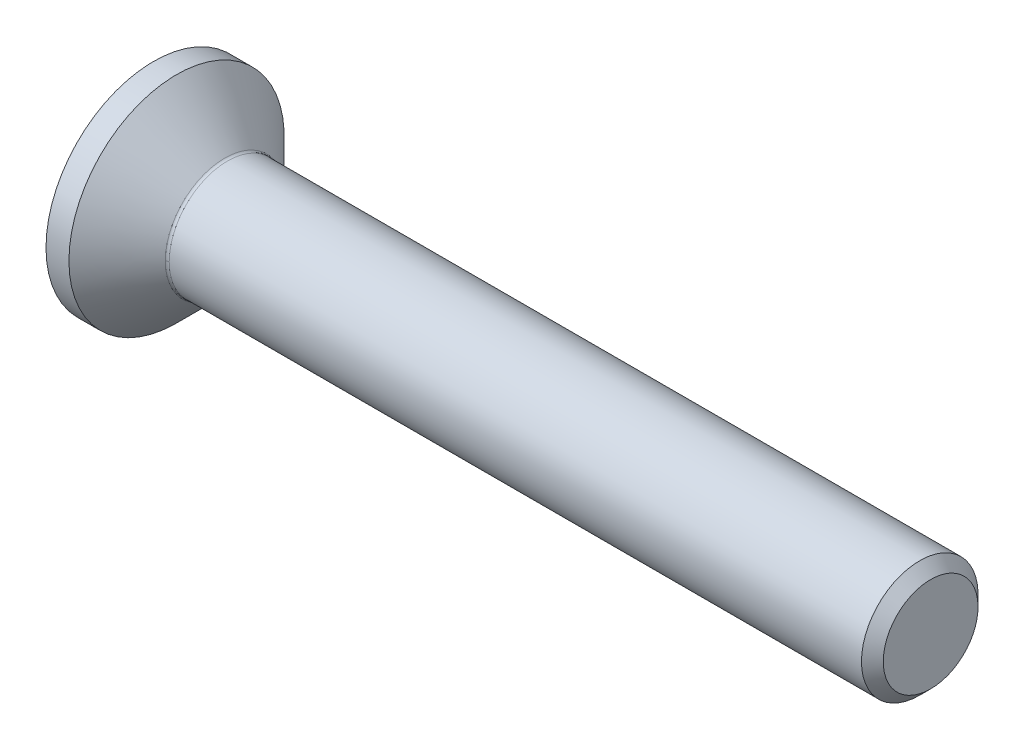
ISO-10303-21;
HEADER;
FILE_DESCRIPTION(('STEP AP214'),'2;1');
FILE_NAME('part.step','',(''),(''),'','','');
FILE_SCHEMA(('AUTOMOTIVE_DESIGN { 1 0 10303 214 1 1 1 1 }'));
ENDSEC;
DATA;
#1=APPLICATION_CONTEXT('core data for automotive mechanical design processes');
#2=APPLICATION_PROTOCOL_DEFINITION('international standard','automotive_design',2000,#1);
#3=PRODUCT_CONTEXT('',#1,'mechanical');
#4=PRODUCT('Part','Part','',(#3));
#5=PRODUCT_RELATED_PRODUCT_CATEGORY('part','',(#4));
#6=PRODUCT_DEFINITION_FORMATION('','',#4);
#7=PRODUCT_DEFINITION_CONTEXT('part definition',#1,'design');
#8=PRODUCT_DEFINITION('design','',#6,#7);
#9=PRODUCT_DEFINITION_SHAPE('','',#8);
#10=(LENGTH_UNIT() NAMED_UNIT(*) SI_UNIT(.MILLI.,.METRE.));
#11=(NAMED_UNIT(*) PLANE_ANGLE_UNIT() SI_UNIT($,.RADIAN.));
#12=(NAMED_UNIT(*) SI_UNIT($,.STERADIAN.) SOLID_ANGLE_UNIT());
#13=UNCERTAINTY_MEASURE_WITH_UNIT(LENGTH_MEASURE(1.E-05),#10,'distance_accuracy_value','');
#14=(GEOMETRIC_REPRESENTATION_CONTEXT(3) GLOBAL_UNCERTAINTY_ASSIGNED_CONTEXT((#13)) GLOBAL_UNIT_ASSIGNED_CONTEXT((#10,
#11,#12)) REPRESENTATION_CONTEXT('',''));
#15=CARTESIAN_POINT('',(0.,0.,0.));
#16=DIRECTION('',(0.,0.,1.));
#17=DIRECTION('',(1.,0.,0.));
#18=AXIS2_PLACEMENT_3D('',#15,#16,#17);
#19=CARTESIAN_POINT('',(20.,-1.234134,1.234134));
#20=DIRECTION('',(1.,0.,0.));
#21=DIRECTION('',(0.,0.,-1.));
#22=AXIS2_PLACEMENT_3D('',#19,#20,#21);
#23=PLANE('',#22);
#24=CARTESIAN_POINT('',(20.,0.,0.));
#25=DIRECTION('',(-1.,0.,0.));
#26=DIRECTION('',(0.,-1.,0.));
#27=AXIS2_PLACEMENT_3D('',#24,#25,#26);
#28=CIRCLE('',#27,1.2195);
#29=CARTESIAN_POINT('',(20.,-1.2195,0.));
#30=VERTEX_POINT('',#29);
#31=EDGE_CURVE('E21',#30,#30,#28,.F.);
#32=ORIENTED_EDGE('',*,*,#31,.T.);
#33=EDGE_LOOP('',(#32));
#34=FACE_BOUND('',#33,.T.);
#35=ADVANCED_FACE('F17',(#34),#23,.T.);
#36=CARTESIAN_POINT('',(20.,0.,0.));
#37=DIRECTION('',(-1.,0.,0.));
#38=DIRECTION('',(0.,-1.,0.));
#39=AXIS2_PLACEMENT_3D('',#36,#37,#38);
#40=CONICAL_SURFACE('',#39,1.2195,0.78539816339745);
#41=ORIENTED_EDGE('',*,*,#31,.F.);
#42=EDGE_LOOP('',(#41));
#43=FACE_BOUND('',#42,.T.);
#44=CARTESIAN_POINT('',(19.7195,0.,0.));
#45=DIRECTION('',(-1.,0.,0.));
#46=DIRECTION('',(0.,0.,1.));
#47=AXIS2_PLACEMENT_3D('',#44,#45,#46);
#48=CIRCLE('',#47,1.5);
#49=CARTESIAN_POINT('',(19.7195,0.,1.5));
#50=VERTEX_POINT('',#49);
#51=EDGE_CURVE('E161',#50,#50,#48,.F.);
#52=ORIENTED_EDGE('',*,*,#51,.T.);
#53=EDGE_LOOP('',(#52));
#54=FACE_BOUND('',#53,.T.);
#55=ADVANCED_FACE('F294',(#43,#54),#40,.T.);
#56=CARTESIAN_POINT('',(19.7195,0.,0.));
#57=DIRECTION('',(-1.,0.,0.));
#58=DIRECTION('',(0.,0.,1.));
#59=AXIS2_PLACEMENT_3D('',#56,#57,#58);
#60=CYLINDRICAL_SURFACE('',#59,1.5);
#61=ORIENTED_EDGE('',*,*,#51,.F.);
#62=EDGE_LOOP('',(#61));
#63=FACE_BOUND('',#62,.T.);
#64=CARTESIAN_POINT('',(1.90142135637504,0.,0.));
#65=DIRECTION('',(1.,0.,0.));
#66=DIRECTION('',(0.,1.,0.));
#67=AXIS2_PLACEMENT_3D('',#64,#65,#66);
#68=CIRCLE('',#67,1.49999999967329);
#69=CARTESIAN_POINT('',(1.90142135628108,-1.53827571386498E-10,-1.49999999975497));
#70=VERTEX_POINT('',#69);
#71=CARTESIAN_POINT('',(1.90142135637474,-6.73452213215498E-11,1.49999999975497));
#72=VERTEX_POINT('',#71);
#73=EDGE_CURVE('E151',#70,#72,#68,.T.);
#74=ORIENTED_EDGE('',*,*,#73,.T.);
#75=CARTESIAN_POINT('',(1.90142135637504,0.,0.));
#76=DIRECTION('',(1.,0.,0.));
#77=DIRECTION('',(0.,1.,0.));
#78=AXIS2_PLACEMENT_3D('',#75,#76,#77);
#79=CIRCLE('',#78,1.49999999967329);
#80=EDGE_CURVE('E140',#72,#70,#79,.T.);
#81=ORIENTED_EDGE('',*,*,#80,.T.);
#82=EDGE_LOOP('',(#74,#81));
#83=FACE_BOUND('',#82,.T.);
#84=ADVANCED_FACE('F298',(#63,#83),#60,.T.);
#85=CARTESIAN_POINT('',(1.911404698,0.,1.500499583));
#86=CARTESIAN_POINT('',(1.911404698,3.000999167,1.500499583));
#87=CARTESIAN_POINT('',(1.911404698,3.000999167,-1.500499583));
#88=CARTESIAN_POINT('',(1.911404698,0.,-1.500499583));
#89=CARTESIAN_POINT('',(1.877326323,0.,1.497080341));
#90=CARTESIAN_POINT('',(1.877326323,2.994160682,1.497080341));
#91=CARTESIAN_POINT('',(1.877326323,2.994160682,-1.497080341));
#92=CARTESIAN_POINT('',(1.877326323,0.,-1.497080341));
#93=CARTESIAN_POINT('',(1.845683929,0.,1.510187049));
#94=CARTESIAN_POINT('',(1.845683929,3.020374099,1.510187049));
#95=CARTESIAN_POINT('',(1.845683929,3.020374099,-1.510187049));
#96=CARTESIAN_POINT('',(1.845683929,0.,-1.510187049));
#97=CARTESIAN_POINT('',(1.824004648,0.,1.536701869));
#98=CARTESIAN_POINT('',(1.824004648,3.073403739,1.536701869));
#99=CARTESIAN_POINT('',(1.824004648,3.073403739,-1.536701869));
#100=CARTESIAN_POINT('',(1.824004648,0.,-1.536701869));
#101=(BOUNDED_SURFACE() B_SPLINE_SURFACE(3,3,((#85,#86,#87,#88),(#89,#90,#91,#92),(#93,#94,#95,
#96),(#97,#98,#99,#100)),.UNSPECIFIED.,.F.,.F.,.F.) B_SPLINE_SURFACE_WITH_KNOTS((4,4),(4,4),(0.,
1.),(0.,1.),.UNSPECIFIED.) GEOMETRIC_REPRESENTATION_ITEM() RATIONAL_B_SPLINE_SURFACE(((1.,
0.333333333333333,0.333333333333333,1.),(0.920706259011135,0.306902086337045,0.306902086337045,
0.920706259011135),(0.920706259011135,0.306902086337045,0.306902086337045,0.920706259011135),
(1.,0.333333333333333,0.333333333333333,1.))) REPRESENTATION_ITEM('') SURFACE());
#102=CARTESIAN_POINT('',(1.830710678,0.,0.));
#103=DIRECTION('',(-1.,0.,0.));
#104=DIRECTION('',(0.,0.,1.));
#105=AXIS2_PLACEMENT_3D('',#102,#103,#104);
#106=CIRCLE('',#105,1.529289322);
#107=CARTESIAN_POINT('',(1.83071067796467,-4.70493724701129E-10,-1.52928932187966));
#108=VERTEX_POINT('',#107);
#109=CARTESIAN_POINT('',(1.8307106779223,-1.37320437139697E-10,1.52928932192202));
#110=VERTEX_POINT('',#109);
#111=EDGE_CURVE('E128',#108,#110,#106,.F.);
#112=CARTESIAN_POINT('',(1.911404698,0.,1.500499583));
#113=CARTESIAN_POINT('',(1.877326323,0.,1.497080341));
#114=CARTESIAN_POINT('',(1.845683929,0.,1.510187049));
#115=CARTESIAN_POINT('',(1.824004648,0.,1.536701869));
#116=(BOUNDED_CURVE() B_SPLINE_CURVE(3,(#112,#113,#114,#115),.UNSPECIFIED.,.F.,
.F.) B_SPLINE_CURVE_WITH_KNOTS((4,4),(0.,1.),
.UNSPECIFIED.) CURVE() GEOMETRIC_REPRESENTATION_ITEM() RATIONAL_B_SPLINE_CURVE((1.,
0.920706259011135,0.920706259011135,1.)) REPRESENTATION_ITEM(''));
#117=EDGE_CURVE('E145',#110,#72,#116,.F.);
#118=CARTESIAN_POINT('',(1.911404698,0.,-1.500499583));
#119=CARTESIAN_POINT('',(1.877326323,0.,-1.497080341));
#120=CARTESIAN_POINT('',(1.845683929,0.,-1.510187049));
#121=CARTESIAN_POINT('',(1.824004648,0.,-1.536701869));
#122=(BOUNDED_CURVE() B_SPLINE_CURVE(3,(#118,#119,#120,#121),.UNSPECIFIED.,.F.,
.F.) B_SPLINE_CURVE_WITH_KNOTS((4,4),(0.,1.),
.UNSPECIFIED.) CURVE() GEOMETRIC_REPRESENTATION_ITEM() RATIONAL_B_SPLINE_CURVE((1.,
0.920706259011135,0.920706259011135,1.)) REPRESENTATION_ITEM(''));
#123=EDGE_CURVE('E131',#70,#108,#122,.T.);
#124=ORIENTED_EDGE('',*,*,#111,.T.);
#125=ORIENTED_EDGE('',*,*,#117,.T.);
#126=ORIENTED_EDGE('',*,*,#73,.F.);
#127=ORIENTED_EDGE('',*,*,#123,.T.);
#128=EDGE_LOOP('',(#124,#125,#126,#127));
#129=FACE_BOUND('',#128,.T.);
#130=ADVANCED_FACE('F302',(#129),#101,.F.);
#131=CARTESIAN_POINT('',(1.911404698,0.,-1.500499583));
#132=CARTESIAN_POINT('',(1.911404698,-3.000999167,-1.500499583));
#133=CARTESIAN_POINT('',(1.911404698,-3.000999167,1.500499583));
#134=CARTESIAN_POINT('',(1.911404698,0.,1.500499583));
#135=CARTESIAN_POINT('',(1.877326323,0.,-1.497080341));
#136=CARTESIAN_POINT('',(1.877326323,-2.994160682,-1.497080341));
#137=CARTESIAN_POINT('',(1.877326323,-2.994160682,1.497080341));
#138=CARTESIAN_POINT('',(1.877326323,0.,1.497080341));
#139=CARTESIAN_POINT('',(1.845683929,0.,-1.510187049));
#140=CARTESIAN_POINT('',(1.845683929,-3.020374099,-1.510187049));
#141=CARTESIAN_POINT('',(1.845683929,-3.020374099,1.510187049));
#142=CARTESIAN_POINT('',(1.845683929,0.,1.510187049));
#143=CARTESIAN_POINT('',(1.824004648,0.,-1.536701869));
#144=CARTESIAN_POINT('',(1.824004648,-3.073403739,-1.536701869));
#145=CARTESIAN_POINT('',(1.824004648,-3.073403739,1.536701869));
#146=CARTESIAN_POINT('',(1.824004648,0.,1.536701869));
#147=(BOUNDED_SURFACE() B_SPLINE_SURFACE(3,3,((#131,#132,#133,#134),(#135,#136,#137,#138),(#139,
#140,#141,#142),(#143,#144,#145,#146)),.UNSPECIFIED.,.F.,.F.,
.F.) B_SPLINE_SURFACE_WITH_KNOTS((4,4),(4,4),(0.,1.),(0.,1.),
.UNSPECIFIED.) GEOMETRIC_REPRESENTATION_ITEM() RATIONAL_B_SPLINE_SURFACE(((1.,0.333333333333333,
0.333333333333333,1.),(0.920706259011135,0.306902086337045,0.306902086337045,0.920706259011135),
(0.920706259011135,0.306902086337045,0.306902086337045,0.920706259011135),(1.,0.333333333333333,
0.333333333333333,1.))) REPRESENTATION_ITEM('') SURFACE());
#148=CARTESIAN_POINT('',(1.830710678,0.,0.));
#149=DIRECTION('',(-1.,0.,0.));
#150=DIRECTION('',(0.,0.,1.));
#151=AXIS2_PLACEMENT_3D('',#148,#149,#150);
#152=CIRCLE('',#151,1.529289322);
#153=EDGE_CURVE('E127',#110,#108,#152,.F.);
#154=ORIENTED_EDGE('',*,*,#123,.F.);
#155=ORIENTED_EDGE('',*,*,#80,.F.);
#156=ORIENTED_EDGE('',*,*,#117,.F.);
#157=ORIENTED_EDGE('',*,*,#153,.T.);
#158=EDGE_LOOP('',(#154,#155,#156,#157));
#159=FACE_BOUND('',#158,.T.);
#160=ADVANCED_FACE('F217',(#159),#147,.F.);
#161=CARTESIAN_POINT('',(1.830710678,0.,0.));
#162=DIRECTION('',(-1.,0.,0.));
#163=DIRECTION('',(0.,-1.,0.));
#164=AXIS2_PLACEMENT_3D('',#161,#162,#163);
#165=CONICAL_SURFACE('',#164,1.529289322,0.785398163397448);
#166=ORIENTED_EDGE('',*,*,#153,.F.);
#167=ORIENTED_EDGE('',*,*,#111,.F.);
#168=EDGE_LOOP('',(#166,#167));
#169=FACE_BOUND('',#168,.T.);
#170=CARTESIAN_POINT('',(0.59,0.,0.));
#171=DIRECTION('',(-1.,0.,0.));
#172=DIRECTION('',(0.,0.,1.));
#173=AXIS2_PLACEMENT_3D('',#170,#171,#172);
#174=CIRCLE('',#173,2.77);
#175=CARTESIAN_POINT('',(0.59,0.,2.77));
#176=VERTEX_POINT('',#175);
#177=EDGE_CURVE('E124',#176,#176,#174,.F.);
#178=ORIENTED_EDGE('',*,*,#177,.T.);
#179=EDGE_LOOP('',(#178));
#180=FACE_BOUND('',#179,.T.);
#181=ADVANCED_FACE('F207',(#169,#180),#165,.T.);
#182=CARTESIAN_POINT('',(0.59,0.,0.));
#183=DIRECTION('',(-1.,0.,0.));
#184=DIRECTION('',(0.,0.,1.));
#185=AXIS2_PLACEMENT_3D('',#182,#183,#184);
#186=CYLINDRICAL_SURFACE('',#185,2.77);
#187=ORIENTED_EDGE('',*,*,#177,.F.);
#188=EDGE_LOOP('',(#187));
#189=FACE_BOUND('',#188,.T.);
#190=CARTESIAN_POINT('',(0.,0.,0.));
#191=DIRECTION('',(-1.,0.,0.));
#192=DIRECTION('',(0.,0.,1.));
#193=AXIS2_PLACEMENT_3D('',#190,#191,#192);
#194=CIRCLE('',#193,2.77);
#195=CARTESIAN_POINT('',(0.,0.,2.77));
#196=VERTEX_POINT('',#195);
#197=EDGE_CURVE('E94',#196,#196,#194,.T.);
#198=ORIENTED_EDGE('',*,*,#197,.F.);
#199=EDGE_LOOP('',(#198));
#200=FACE_BOUND('',#199,.T.);
#201=ADVANCED_FACE('F205',(#189,#200),#186,.T.);
#202=CARTESIAN_POINT('',(0.,1.154700538,0.));
#203=DIRECTION('',(0.,-0.866025403855548,0.499999999876835));
#204=DIRECTION('',(0.,-0.499999999876835,-0.866025403855548));
#205=AXIS2_PLACEMENT_3D('',#202,#203,#204);
#206=PLANE('',#205);
#207=DIRECTION('',(0.,-0.499999999876835,-0.866025403855548));
#208=VECTOR('',#207,1.);
#209=CARTESIAN_POINT('',(1.1,1.154700538,0.));
#210=LINE('',#209,#208);
#211=CARTESIAN_POINT('',(1.1,0.866025403811628,-0.499999999706576));
#212=VERTEX_POINT('',#211);
#213=CARTESIAN_POINT('',(1.1,1.154700538,0.));
#214=VERTEX_POINT('',#213);
#215=EDGE_CURVE('E197',#212,#214,#210,.F.);
#216=ORIENTED_EDGE('',*,*,#215,.T.);
#217=DIRECTION('',(1.,0.,0.));
#218=VECTOR('',#217,1.);
#219=CARTESIAN_POINT('',(0.55,1.154700538,0.));
#220=LINE('',#219,#218);
#221=CARTESIAN_POINT('',(0.,1.15470053961491,-2.5428248916215E-10));
#222=VERTEX_POINT('',#221);
#223=EDGE_CURVE('E89',#222,#214,#220,.T.);
#224=ORIENTED_EDGE('',*,*,#223,.F.);
#225=DIRECTION('',(0.,0.500000000104632,0.866025403724029));
#226=VECTOR('',#225,1.);
#227=CARTESIAN_POINT('',(0.,0.57735027017448,-1.0000000014268));
#228=LINE('',#227,#226);
#229=CARTESIAN_POINT('',(0.,0.577350269999122,-1.));
#230=VERTEX_POINT('',#229);
#231=EDGE_CURVE('E83',#230,#222,#228,.T.);
#232=ORIENTED_EDGE('',*,*,#231,.F.);
#233=DIRECTION('',(-1.,0.,0.));
#234=VECTOR('',#233,1.);
#235=CARTESIAN_POINT('',(0.55,0.577350269,-1.));
#236=LINE('',#235,#234);
#237=CARTESIAN_POINT('',(1.1,0.577350269,-1.));
#238=VERTEX_POINT('',#237);
#239=EDGE_CURVE('E88',#238,#230,#236,.T.);
#240=ORIENTED_EDGE('',*,*,#239,.F.);
#241=DIRECTION('',(0.,-0.499999999876835,-0.866025403855548));
#242=VECTOR('',#241,1.);
#243=CARTESIAN_POINT('',(1.1,1.154700538,0.));
#244=LINE('',#243,#242);
#245=EDGE_CURVE('E112',#238,#212,#244,.F.);
#246=ORIENTED_EDGE('',*,*,#245,.T.);
#247=EDGE_LOOP('',(#216,#224,#232,#240,#246));
#248=FACE_BOUND('',#247,.T.);
#249=ADVANCED_FACE('F86',(#248),#206,.T.);
#250=CARTESIAN_POINT('',(0.,0.577350269,1.));
#251=DIRECTION('',(0.,-0.866025403855548,-0.499999999876835));
#252=DIRECTION('',(0.,0.499999999876835,-0.866025403855548));
#253=AXIS2_PLACEMENT_3D('',#250,#251,#252);
#254=PLANE('',#253);
#255=DIRECTION('',(0.,0.499999999876835,-0.866025403855548));
#256=VECTOR('',#255,1.);
#257=CARTESIAN_POINT('',(1.1,0.577350269,1.));
#258=LINE('',#257,#256);
#259=CARTESIAN_POINT('',(1.1,0.866025403522998,0.499999999960167));
#260=VERTEX_POINT('',#259);
#261=CARTESIAN_POINT('',(1.1,0.577350269,1.));
#262=VERTEX_POINT('',#261);
#263=EDGE_CURVE('E199',#260,#262,#258,.F.);
#264=ORIENTED_EDGE('',*,*,#263,.T.);
#265=DIRECTION('',(1.,0.,0.));
#266=VECTOR('',#265,1.);
#267=CARTESIAN_POINT('',(0.55,0.577350269,1.));
#268=LINE('',#267,#266);
#269=CARTESIAN_POINT('',(0.,0.577350269999122,1.));
#270=VERTEX_POINT('',#269);
#271=EDGE_CURVE('E119',#270,#262,#268,.T.);
#272=ORIENTED_EDGE('',*,*,#271,.F.);
#273=DIRECTION('',(0.,-0.500000000104632,0.866025403724029));
#274=VECTOR('',#273,1.);
#275=CARTESIAN_POINT('',(0.,1.15470054034896,0.));
#276=LINE('',#275,#274);
#277=EDGE_CURVE('E93',#222,#270,#276,.T.);
#278=ORIENTED_EDGE('',*,*,#277,.F.);
#279=ORIENTED_EDGE('',*,*,#223,.T.);
#280=DIRECTION('',(0.,0.499999999876835,-0.866025403855548));
#281=VECTOR('',#280,1.);
#282=CARTESIAN_POINT('',(1.1,0.577350269,1.));
#283=LINE('',#282,#281);
#284=EDGE_CURVE('E115',#214,#260,#283,.F.);
#285=ORIENTED_EDGE('',*,*,#284,.T.);
#286=EDGE_LOOP('',(#264,#272,#278,#279,#285));
#287=FACE_BOUND('',#286,.T.);
#288=ADVANCED_FACE('F215',(#287),#254,.T.);
#289=CARTESIAN_POINT('',(0.,-2.80324,-2.80324));
#290=DIRECTION('',(-1.,0.,0.));
#291=DIRECTION('',(0.,0.,1.));
#292=AXIS2_PLACEMENT_3D('',#289,#290,#291);
#293=PLANE('',#292);
#294=ORIENTED_EDGE('',*,*,#277,.T.);
#295=DIRECTION('',(0.,1.,0.));
#296=VECTOR('',#295,1.);
#297=CARTESIAN_POINT('',(0.,0.,1.));
#298=LINE('',#297,#296);
#299=CARTESIAN_POINT('',(0.,-0.577350269,1.));
#300=VERTEX_POINT('',#299);
#301=EDGE_CURVE('E347',#300,#270,#298,.T.);
#302=ORIENTED_EDGE('',*,*,#301,.F.);
#303=DIRECTION('',(0.,0.499999999876835,0.866025403855548));
#304=VECTOR('',#303,1.);
#305=CARTESIAN_POINT('',(0.,-0.8660254035,0.5));
#306=LINE('',#305,#304);
#307=CARTESIAN_POINT('',(0.,-1.154700538,0.));
#308=VERTEX_POINT('',#307);
#309=EDGE_CURVE('E343',#308,#300,#306,.T.);
#310=ORIENTED_EDGE('',*,*,#309,.F.);
#311=DIRECTION('',(0.,-0.499999999876835,0.866025403855548));
#312=VECTOR('',#311,1.);
#313=CARTESIAN_POINT('',(0.,-0.8660254035,-0.5));
#314=LINE('',#313,#312);
#315=CARTESIAN_POINT('',(0.,-0.577350269,-1.));
#316=VERTEX_POINT('',#315);
#317=EDGE_CURVE('E105',#316,#308,#314,.T.);
#318=ORIENTED_EDGE('',*,*,#317,.F.);
#319=DIRECTION('',(0.,-1.,0.));
#320=VECTOR('',#319,1.);
#321=CARTESIAN_POINT('',(0.,0.,-1.));
#322=LINE('',#321,#320);
#323=EDGE_CURVE('E100',#230,#316,#322,.T.);
#324=ORIENTED_EDGE('',*,*,#323,.F.);
#325=ORIENTED_EDGE('',*,*,#231,.T.);
#326=EDGE_LOOP('',(#294,#302,#310,#318,#324,#325));
#327=FACE_BOUND('',#326,.T.);
#328=ORIENTED_EDGE('',*,*,#197,.T.);
#329=EDGE_LOOP('',(#328));
#330=FACE_BOUND('',#329,.T.);
#331=ADVANCED_FACE('F108',(#327,#330),#293,.T.);
#332=CARTESIAN_POINT('',(1.1,-0.005196152,1.));
#333=DIRECTION('',(1.,0.,0.));
#334=DIRECTION('',(0.,0.,-1.));
#335=AXIS2_PLACEMENT_3D('',#332,#333,#334);
#336=PLANE('',#335);
#337=ORIENTED_EDGE('',*,*,#263,.F.);
#338=CARTESIAN_POINT('',(1.1,0.,0.));
#339=DIRECTION('',(-1.,0.,0.));
#340=DIRECTION('',(0.,0.,1.));
#341=AXIS2_PLACEMENT_3D('',#338,#339,#340);
#342=CIRCLE('',#341,1.);
#343=CARTESIAN_POINT('',(1.1,-8.9793628428733E-11,1.));
#344=VERTEX_POINT('',#343);
#345=EDGE_CURVE('E191',#344,#260,#342,.T.);
#346=ORIENTED_EDGE('',*,*,#345,.F.);
#347=DIRECTION('',(0.,-1.,0.));
#348=VECTOR('',#347,1.);
#349=CARTESIAN_POINT('',(1.1,0.,1.));
#350=LINE('',#349,#348);
#351=EDGE_CURVE('E250',#262,#344,#350,.T.);
#352=ORIENTED_EDGE('',*,*,#351,.F.);
#353=EDGE_LOOP('',(#337,#346,#352));
#354=FACE_BOUND('',#353,.T.);
#355=ADVANCED_FACE('F249',(#354),#336,.F.);
#356=CARTESIAN_POINT('',(1.1,0.864293353,0.506));
#357=DIRECTION('',(1.,0.,0.));
#358=DIRECTION('',(0.,0.,-1.));
#359=AXIS2_PLACEMENT_3D('',#356,#357,#358);
#360=PLANE('',#359);
#361=ORIENTED_EDGE('',*,*,#215,.F.);
#362=CARTESIAN_POINT('',(1.1,0.,0.));
#363=DIRECTION('',(-1.,0.,0.));
#364=DIRECTION('',(0.,0.,1.));
#365=AXIS2_PLACEMENT_3D('',#362,#363,#364);
#366=CIRCLE('',#365,1.);
#367=EDGE_CURVE('E188',#260,#212,#366,.T.);
#368=ORIENTED_EDGE('',*,*,#367,.F.);
#369=ORIENTED_EDGE('',*,*,#284,.F.);
#370=EDGE_LOOP('',(#361,#368,#369));
#371=FACE_BOUND('',#370,.T.);
#372=ADVANCED_FACE('F256',(#371),#360,.F.);
#373=CARTESIAN_POINT('',(1.1,-0.005196152,-0.497));
#374=DIRECTION('',(1.,0.,0.));
#375=DIRECTION('',(0.,0.,-1.));
#376=AXIS2_PLACEMENT_3D('',#373,#374,#375);
#377=PLANE('',#376);
#378=DIRECTION('',(0.,1.,0.));
#379=VECTOR('',#378,1.);
#380=CARTESIAN_POINT('',(1.1,0.,-1.));
#381=LINE('',#380,#379);
#382=CARTESIAN_POINT('',(1.1,-2.05103456854677E-10,-1.));
#383=VERTEX_POINT('',#382);
#384=EDGE_CURVE('E104',#383,#238,#381,.T.);
#385=ORIENTED_EDGE('',*,*,#384,.F.);
#386=CARTESIAN_POINT('',(1.1,0.,0.));
#387=DIRECTION('',(-1.,0.,0.));
#388=DIRECTION('',(0.,0.,1.));
#389=AXIS2_PLACEMENT_3D('',#386,#387,#388);
#390=CIRCLE('',#389,1.);
#391=EDGE_CURVE('E186',#212,#383,#390,.T.);
#392=ORIENTED_EDGE('',*,*,#391,.F.);
#393=ORIENTED_EDGE('',*,*,#245,.F.);
#394=EDGE_LOOP('',(#385,#392,#393));
#395=FACE_BOUND('',#394,.T.);
#396=ADVANCED_FACE('F259',(#395),#377,.F.);
#397=CARTESIAN_POINT('',(0.,0.577350269,-1.));
#398=DIRECTION('',(0.,0.,1.));
#399=DIRECTION('',(0.,-1.,0.));
#400=AXIS2_PLACEMENT_3D('',#397,#398,#399);
#401=PLANE('',#400);
#402=ORIENTED_EDGE('',*,*,#384,.T.);
#403=ORIENTED_EDGE('',*,*,#239,.T.);
#404=ORIENTED_EDGE('',*,*,#323,.T.);
#405=DIRECTION('',(-1.,0.,0.));
#406=VECTOR('',#405,1.);
#407=CARTESIAN_POINT('',(0.55,-0.577350269,-1.));
#408=LINE('',#407,#406);
#409=CARTESIAN_POINT('',(1.1,-0.577350269,-1.));
#410=VERTEX_POINT('',#409);
#411=EDGE_CURVE('E261',#410,#316,#408,.T.);
#412=ORIENTED_EDGE('',*,*,#411,.F.);
#413=DIRECTION('',(0.,1.,0.));
#414=VECTOR('',#413,1.);
#415=CARTESIAN_POINT('',(1.1,-0.433012702,-1.));
#416=LINE('',#415,#414);
#417=EDGE_CURVE('E182',#410,#383,#416,.T.);
#418=ORIENTED_EDGE('',*,*,#417,.T.);
#419=EDGE_LOOP('',(#402,#403,#404,#412,#418));
#420=FACE_BOUND('',#419,.T.);
#421=ADVANCED_FACE('F99',(#420),#401,.T.);
#422=CARTESIAN_POINT('',(0.,-0.577350269,-1.));
#423=DIRECTION('',(0.,0.866025403855548,0.499999999876835));
#424=DIRECTION('',(0.,-0.499999999876835,0.866025403855548));
#425=AXIS2_PLACEMENT_3D('',#422,#423,#424);
#426=PLANE('',#425);
#427=DIRECTION('',(0.,-0.499999999876835,0.866025403855548));
#428=VECTOR('',#427,1.);
#429=CARTESIAN_POINT('',(1.1,-0.577350269,-1.));
#430=LINE('',#429,#428);
#431=CARTESIAN_POINT('',(1.1,-0.86602540364751,-0.499999999990837));
#432=VERTEX_POINT('',#431);
#433=EDGE_CURVE('E183',#432,#410,#430,.F.);
#434=ORIENTED_EDGE('',*,*,#433,.T.);
#435=ORIENTED_EDGE('',*,*,#411,.T.);
#436=ORIENTED_EDGE('',*,*,#317,.T.);
#437=DIRECTION('',(-1.,0.,0.));
#438=VECTOR('',#437,1.);
#439=CARTESIAN_POINT('',(0.55,-1.154700538,0.));
#440=LINE('',#439,#438);
#441=CARTESIAN_POINT('',(1.1,-1.154700538,0.));
#442=VERTEX_POINT('',#441);
#443=EDGE_CURVE('E193',#442,#308,#440,.T.);
#444=ORIENTED_EDGE('',*,*,#443,.F.);
#445=DIRECTION('',(0.,-0.499999999876835,0.866025403855548));
#446=VECTOR('',#445,1.);
#447=CARTESIAN_POINT('',(1.1,-0.577350269,-1.));
#448=LINE('',#447,#446);
#449=EDGE_CURVE('E178',#442,#432,#448,.F.);
#450=ORIENTED_EDGE('',*,*,#449,.T.);
#451=EDGE_LOOP('',(#434,#435,#436,#444,#450));
#452=FACE_BOUND('',#451,.T.);
#453=ADVANCED_FACE('F266',(#452),#426,.T.);
#454=CARTESIAN_POINT('',(0.,-0.577350269,1.));
#455=DIRECTION('',(0.,0.,-1.));
#456=DIRECTION('',(0.,1.,0.));
#457=AXIS2_PLACEMENT_3D('',#454,#455,#456);
#458=PLANE('',#457);
#459=DIRECTION('',(0.,-1.,0.));
#460=VECTOR('',#459,1.);
#461=CARTESIAN_POINT('',(1.1,-0.433012702,1.));
#462=LINE('',#461,#460);
#463=CARTESIAN_POINT('',(1.1,-0.577350269,1.));
#464=VERTEX_POINT('',#463);
#465=EDGE_CURVE('E177',#344,#464,#462,.T.);
#466=ORIENTED_EDGE('',*,*,#465,.T.);
#467=DIRECTION('',(1.,0.,0.));
#468=VECTOR('',#467,1.);
#469=CARTESIAN_POINT('',(0.55,-0.577350269,1.));
#470=LINE('',#469,#468);
#471=EDGE_CURVE('E241',#300,#464,#470,.T.);
#472=ORIENTED_EDGE('',*,*,#471,.F.);
#473=ORIENTED_EDGE('',*,*,#301,.T.);
#474=ORIENTED_EDGE('',*,*,#271,.T.);
#475=ORIENTED_EDGE('',*,*,#351,.T.);
#476=EDGE_LOOP('',(#466,#472,#473,#474,#475));
#477=FACE_BOUND('',#476,.T.);
#478=ADVANCED_FACE('F275',(#477),#458,.T.);
#479=CARTESIAN_POINT('',(0.,-1.154700538,0.));
#480=DIRECTION('',(0.,0.866025403855548,-0.499999999876835));
#481=DIRECTION('',(0.,0.499999999876835,0.866025403855548));
#482=AXIS2_PLACEMENT_3D('',#479,#480,#481);
#483=PLANE('',#482);
#484=DIRECTION('',(0.,0.499999999876835,0.866025403855548));
#485=VECTOR('',#484,1.);
#486=CARTESIAN_POINT('',(1.1,-1.154700538,0.));
#487=LINE('',#486,#485);
#488=CARTESIAN_POINT('',(1.1,-0.8660254037389,0.499999999832545));
#489=VERTEX_POINT('',#488);
#490=EDGE_CURVE('E36',#489,#442,#487,.F.);
#491=ORIENTED_EDGE('',*,*,#490,.T.);
#492=ORIENTED_EDGE('',*,*,#443,.T.);
#493=ORIENTED_EDGE('',*,*,#309,.T.);
#494=ORIENTED_EDGE('',*,*,#471,.T.);
#495=DIRECTION('',(0.,0.499999999876835,0.866025403855548));
#496=VECTOR('',#495,1.);
#497=CARTESIAN_POINT('',(1.1,-1.154700538,0.));
#498=LINE('',#497,#496);
#499=EDGE_CURVE('E174',#464,#489,#498,.F.);
#500=ORIENTED_EDGE('',*,*,#499,.T.);
#501=EDGE_LOOP('',(#491,#492,#493,#494,#500));
#502=FACE_BOUND('',#501,.T.);
#503=ADVANCED_FACE('F237',(#502),#483,.T.);
#504=CARTESIAN_POINT('',(1.1,-0.871221556,-0.497));
#505=DIRECTION('',(1.,0.,0.));
#506=DIRECTION('',(0.,0.,-1.));
#507=AXIS2_PLACEMENT_3D('',#504,#505,#506);
#508=PLANE('',#507);
#509=ORIENTED_EDGE('',*,*,#433,.F.);
#510=CARTESIAN_POINT('',(1.1,0.,0.));
#511=DIRECTION('',(-1.,0.,0.));
#512=DIRECTION('',(0.,0.,1.));
#513=AXIS2_PLACEMENT_3D('',#510,#511,#512);
#514=CIRCLE('',#513,1.);
#515=EDGE_CURVE('E171',#383,#432,#514,.T.);
#516=ORIENTED_EDGE('',*,*,#515,.F.);
#517=ORIENTED_EDGE('',*,*,#417,.F.);
#518=EDGE_LOOP('',(#509,#516,#517));
#519=FACE_BOUND('',#518,.T.);
#520=ADVANCED_FACE('F264',(#519),#508,.F.);
#521=CARTESIAN_POINT('',(1.1,-1.156432589,0.506));
#522=DIRECTION('',(1.,0.,0.));
#523=DIRECTION('',(0.,0.,-1.));
#524=AXIS2_PLACEMENT_3D('',#521,#522,#523);
#525=PLANE('',#524);
#526=ORIENTED_EDGE('',*,*,#490,.F.);
#527=CARTESIAN_POINT('',(1.1,0.,0.));
#528=DIRECTION('',(-1.,0.,0.));
#529=DIRECTION('',(0.,0.,1.));
#530=AXIS2_PLACEMENT_3D('',#527,#528,#529);
#531=CIRCLE('',#530,1.);
#532=EDGE_CURVE('E27',#432,#489,#531,.T.);
#533=ORIENTED_EDGE('',*,*,#532,.F.);
#534=ORIENTED_EDGE('',*,*,#449,.F.);
#535=EDGE_LOOP('',(#526,#533,#534));
#536=FACE_BOUND('',#535,.T.);
#537=ADVANCED_FACE('F228',(#536),#525,.F.);
#538=CARTESIAN_POINT('',(1.1,-0.871221556,1.));
#539=DIRECTION('',(1.,0.,0.));
#540=DIRECTION('',(0.,0.,-1.));
#541=AXIS2_PLACEMENT_3D('',#538,#539,#540);
#542=PLANE('',#541);
#543=ORIENTED_EDGE('',*,*,#465,.F.);
#544=CARTESIAN_POINT('',(1.1,0.,0.));
#545=DIRECTION('',(-1.,0.,0.));
#546=DIRECTION('',(0.,0.,1.));
#547=AXIS2_PLACEMENT_3D('',#544,#545,#546);
#548=CIRCLE('',#547,1.);
#549=EDGE_CURVE('E11',#489,#344,#548,.T.);
#550=ORIENTED_EDGE('',*,*,#549,.F.);
#551=ORIENTED_EDGE('',*,*,#499,.F.);
#552=EDGE_LOOP('',(#543,#550,#551));
#553=FACE_BOUND('',#552,.T.);
#554=ADVANCED_FACE('F19',(#553),#542,.F.);
#555=CARTESIAN_POINT('',(1.677350269,0.,0.));
#556=DIRECTION('',(-1.,0.,0.));
#557=DIRECTION('',(0.,0.,1.));
#558=AXIS2_PLACEMENT_3D('',#555,#556,#557);
#559=CONICAL_SURFACE('',#558,0.,1.04719755133882);
#560=CARTESIAN_POINT('',(1.677350269,0.,0.));
#561=VERTEX_POINT('',#560);
#562=VERTEX_LOOP('',#561);
#563=FACE_BOUND('',#562,.T.);
#564=ORIENTED_EDGE('',*,*,#532,.T.);
#565=ORIENTED_EDGE('',*,*,#549,.T.);
#566=ORIENTED_EDGE('',*,*,#345,.T.);
#567=ORIENTED_EDGE('',*,*,#367,.T.);
#568=ORIENTED_EDGE('',*,*,#391,.T.);
#569=ORIENTED_EDGE('',*,*,#515,.T.);
#570=EDGE_LOOP('',(#564,#565,#566,#567,#568,#569));
#571=FACE_BOUND('',#570,.T.);
#572=ADVANCED_FACE('F222',(#563,#571),#559,.F.);
#573=CLOSED_SHELL('',(#35,#55,#84,#130,#160,#181,#201,#249,#288,#331,#355,#372,#396,#421,#453,
#478,#503,#520,#537,#554,#572));
#574=MANIFOLD_SOLID_BREP('B1',#573);
#575=ADVANCED_BREP_SHAPE_REPRESENTATION('',(#18,#574),#14);
#576=SHAPE_DEFINITION_REPRESENTATION(#9,#575);
ENDSEC;
END-ISO-10303-21;
